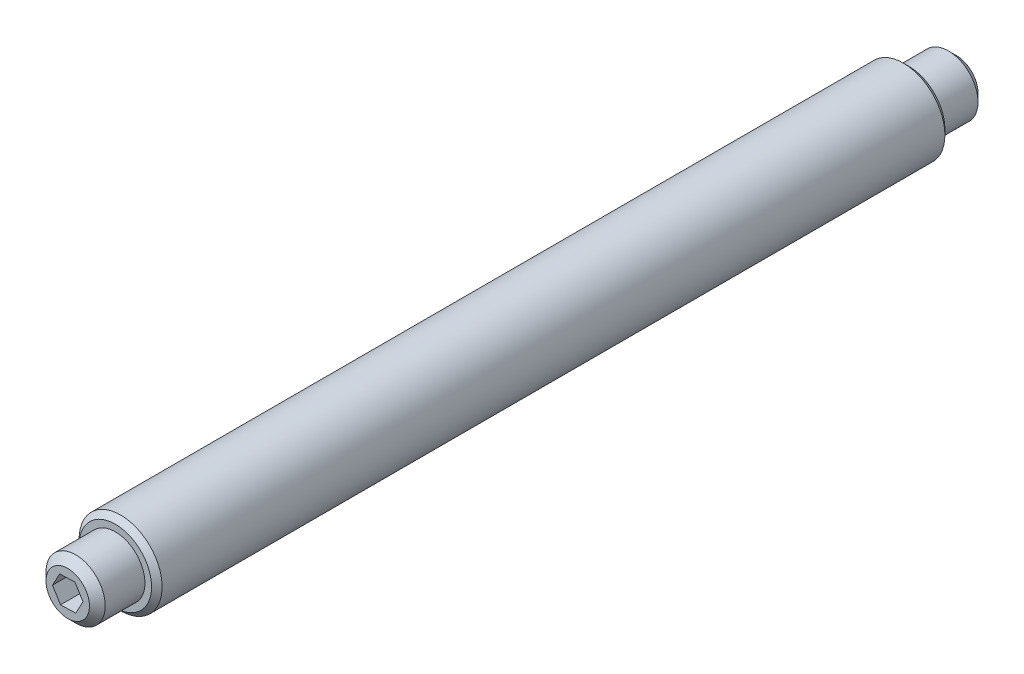
ISO-10303-21;
HEADER;
FILE_DESCRIPTION(('STEP AP214'),'2;1');
FILE_NAME('part.step','',(''),(''),'','','');
FILE_SCHEMA(('AUTOMOTIVE_DESIGN { 1 0 10303 214 1 1 1 1 }'));
ENDSEC;
DATA;
#1=APPLICATION_CONTEXT('core data for automotive mechanical design processes');
#2=APPLICATION_PROTOCOL_DEFINITION('international standard','automotive_design',2000,#1);
#3=PRODUCT_CONTEXT('',#1,'mechanical');
#4=PRODUCT('Part','Part','',(#3));
#5=PRODUCT_RELATED_PRODUCT_CATEGORY('part','',(#4));
#6=PRODUCT_DEFINITION_FORMATION('','',#4);
#7=PRODUCT_DEFINITION_CONTEXT('part definition',#1,'design');
#8=PRODUCT_DEFINITION('design','',#6,#7);
#9=PRODUCT_DEFINITION_SHAPE('','',#8);
#10=(LENGTH_UNIT() NAMED_UNIT(*) SI_UNIT(.MILLI.,.METRE.));
#11=(NAMED_UNIT(*) PLANE_ANGLE_UNIT() SI_UNIT($,.RADIAN.));
#12=(NAMED_UNIT(*) SI_UNIT($,.STERADIAN.) SOLID_ANGLE_UNIT());
#13=UNCERTAINTY_MEASURE_WITH_UNIT(LENGTH_MEASURE(1.E-05),#10,'distance_accuracy_value','');
#14=(GEOMETRIC_REPRESENTATION_CONTEXT(3) GLOBAL_UNCERTAINTY_ASSIGNED_CONTEXT((#13)) GLOBAL_UNIT_ASSIGNED_CONTEXT((#10,
#11,#12)) REPRESENTATION_CONTEXT('',''));
#15=CARTESIAN_POINT('',(0.,0.,0.));
#16=DIRECTION('',(0.,0.,1.));
#17=DIRECTION('',(1.,0.,0.));
#18=AXIS2_PLACEMENT_3D('',#15,#16,#17);
#19=CARTESIAN_POINT('',(0.,0.,19.05));
#20=DIRECTION('',(0.,0.,-1.));
#21=DIRECTION('',(-1.,0.,0.));
#22=AXIS2_PLACEMENT_3D('',#19,#20,#21);
#23=CYLINDRICAL_SURFACE('',#22,1.9939);
#24=CARTESIAN_POINT('',(0.,0.,18.796));
#25=DIRECTION('',(0.,0.,1.));
#26=DIRECTION('',(1.,0.,0.));
#27=AXIS2_PLACEMENT_3D('',#24,#25,#26);
#28=CIRCLE('',#27,1.9939);
#29=CARTESIAN_POINT('',(-1.9939,0.,18.796));
#30=VERTEX_POINT('',#29);
#31=EDGE_CURVE('P0_E11',#30,#30,#28,.F.);
#32=CARTESIAN_POINT('',(0.,0.,-18.7959999999999));
#33=DIRECTION('',(0.,0.,1.));
#34=DIRECTION('',(1.,0.,0.));
#35=AXIS2_PLACEMENT_3D('',#32,#33,#34);
#36=CIRCLE('',#35,1.9939);
#37=CARTESIAN_POINT('',(-1.9939,0.,-18.796));
#38=VERTEX_POINT('',#37);
#39=EDGE_CURVE('P0_E63',#38,#38,#36,.T.);
#40=CARTESIAN_POINT('',(-1.9939,0.,18.796));
#41=CARTESIAN_POINT('',(-1.9939,0.,18.4044166666667));
#42=CARTESIAN_POINT('',(-1.9939,0.,18.0128333333333));
#43=CARTESIAN_POINT('',(-1.9939,0.,17.2296666666667));
#44=CARTESIAN_POINT('',(-1.9939,0.,16.8380833333333));
#45=CARTESIAN_POINT('',(-1.9939,0.,16.0549166666667));
#46=CARTESIAN_POINT('',(-1.9939,0.,15.6633333333333));
#47=CARTESIAN_POINT('',(-1.9939,0.,14.8801666666667));
#48=CARTESIAN_POINT('',(-1.9939,0.,14.4885833333333));
#49=CARTESIAN_POINT('',(-1.9939,0.,13.7054166666667));
#50=CARTESIAN_POINT('',(-1.9939,0.,13.3138333333333));
#51=CARTESIAN_POINT('',(-1.9939,0.,12.5306666666667));
#52=CARTESIAN_POINT('',(-1.9939,0.,12.1390833333334));
#53=CARTESIAN_POINT('',(-1.9939,0.,11.3559166666667));
#54=CARTESIAN_POINT('',(-1.9939,0.,10.9643333333334));
#55=CARTESIAN_POINT('',(-1.9939,0.,10.1811666666667));
#56=CARTESIAN_POINT('',(-1.9939,0.,9.78958333333335));
#57=CARTESIAN_POINT('',(-1.9939,0.,9.00641666666669));
#58=CARTESIAN_POINT('',(-1.9939,0.,8.61483333333335));
#59=CARTESIAN_POINT('',(-1.9939,0.,7.83166666666669));
#60=CARTESIAN_POINT('',(-1.9939,0.,7.44008333333336));
#61=CARTESIAN_POINT('',(-1.9939,0.,6.65691666666669));
#62=CARTESIAN_POINT('',(-1.9939,0.,6.26533333333336));
#63=CARTESIAN_POINT('',(-1.9939,0.,5.48216666666669));
#64=CARTESIAN_POINT('',(-1.9939,0.,5.09058333333336));
#65=CARTESIAN_POINT('',(-1.9939,0.,4.30741666666669));
#66=CARTESIAN_POINT('',(-1.9939,0.,3.91583333333336));
#67=CARTESIAN_POINT('',(-1.9939,0.,3.13266666666669));
#68=CARTESIAN_POINT('',(-1.9939,0.,2.74108333333336));
#69=CARTESIAN_POINT('',(-1.9939,0.,1.95791666666669));
#70=CARTESIAN_POINT('',(-1.9939,0.,1.56633333333336));
#71=CARTESIAN_POINT('',(-1.9939,0.,0.783166666666694));
#72=CARTESIAN_POINT('',(-1.9939,0.,0.391583333333361));
#73=CARTESIAN_POINT('',(-1.9939,0.,-0.391583333333305));
#74=CARTESIAN_POINT('',(-1.9939,0.,-0.783166666666638));
#75=CARTESIAN_POINT('',(-1.9939,0.,-1.5663333333333));
#76=CARTESIAN_POINT('',(-1.9939,0.,-1.95791666666664));
#77=CARTESIAN_POINT('',(-1.9939,0.,-2.7410833333333));
#78=CARTESIAN_POINT('',(-1.9939,0.,-3.13266666666664));
#79=CARTESIAN_POINT('',(-1.9939,0.,-3.9158333333333));
#80=CARTESIAN_POINT('',(-1.9939,0.,-4.30741666666663));
#81=CARTESIAN_POINT('',(-1.9939,0.,-5.0905833333333));
#82=CARTESIAN_POINT('',(-1.9939,0.,-5.48216666666664));
#83=CARTESIAN_POINT('',(-1.9939,0.,-6.2653333333333));
#84=CARTESIAN_POINT('',(-1.9939,0.,-6.65691666666663));
#85=CARTESIAN_POINT('',(-1.9939,0.,-7.4400833333333));
#86=CARTESIAN_POINT('',(-1.9939,0.,-7.83166666666663));
#87=CARTESIAN_POINT('',(-1.9939,0.,-8.6148333333333));
#88=CARTESIAN_POINT('',(-1.9939,0.,-9.00641666666663));
#89=CARTESIAN_POINT('',(-1.9939,0.,-9.7895833333333));
#90=CARTESIAN_POINT('',(-1.9939,0.,-10.1811666666666));
#91=CARTESIAN_POINT('',(-1.9939,0.,-10.9643333333333));
#92=CARTESIAN_POINT('',(-1.9939,0.,-11.3559166666666));
#93=CARTESIAN_POINT('',(-1.9939,0.,-12.1390833333333));
#94=CARTESIAN_POINT('',(-1.9939,0.,-12.5306666666666));
#95=CARTESIAN_POINT('',(-1.9939,0.,-13.3138333333333));
#96=CARTESIAN_POINT('',(-1.9939,0.,-13.7054166666666));
#97=CARTESIAN_POINT('',(-1.9939,0.,-14.4885833333333));
#98=CARTESIAN_POINT('',(-1.9939,0.,-14.8801666666666));
#99=CARTESIAN_POINT('',(-1.9939,0.,-15.6633333333333));
#100=CARTESIAN_POINT('',(-1.9939,0.,-16.0549166666666));
#101=CARTESIAN_POINT('',(-1.9939,0.,-16.8380833333333));
#102=CARTESIAN_POINT('',(-1.9939,0.,-17.2296666666666));
#103=CARTESIAN_POINT('',(-1.9939,0.,-18.0128333333333));
#104=CARTESIAN_POINT('',(-1.9939,0.,-18.4044166666666));
#105=CARTESIAN_POINT('',(-1.9939,0.,-18.796));
#106=B_SPLINE_CURVE_WITH_KNOTS('',3,(#40,#41,#42,#43,#44,#45,#46,#47,#48,#49,#50,#51,#52,#53,
#54,#55,#56,#57,#58,#59,#60,#61,#62,#63,#64,#65,#66,#67,#68,#69,#70,#71,#72,#73,#74,#75,#76,#77,
#78,#79,#80,#81,#82,#83,#84,#85,#86,#87,#88,#89,#90,#91,#92,#93,#94,#95,#96,#97,#98,#99,#100,
#101,#102,#103,#104,#105),.UNSPECIFIED.,.F.,.F.,(4,2,2,2,2,2,2,2,2,2,2,2,2,2,2,2,2,2,2,2,2,2,2,
2,2,2,2,2,2,2,2,2,4),(0.,1.17475,2.3495,3.52425,4.69899999999999,5.87374999999999,
7.04849999999999,8.22324999999999,9.39799999999999,10.57275,11.7475,12.92225,14.097,15.27175,
16.4465,17.62125,18.796,19.97075,21.1455,22.32025,23.495,24.66975,25.8445,27.01925,28.194,
29.36875,30.5435,31.71825,32.893,34.06775,35.2425,36.41725,37.592),.UNSPECIFIED.);
#107=EDGE_CURVE('P0_BSEAM17',#30,#38,#106,.T.);
#108=ORIENTED_EDGE('',*,*,#31,.T.);
#109=ORIENTED_EDGE('',*,*,#39,.T.);
#110=ORIENTED_EDGE('',*,*,#107,.T.);
#111=ORIENTED_EDGE('',*,*,#107,.F.);
#112=EDGE_LOOP('',(#108,#110,#109,#111));
#113=FACE_BOUND('',#112,.T.);
#114=ADVANCED_FACE('P0_F17',(#113),#23,.T.);
#115=CARTESIAN_POINT('',(0.,0.,19.05));
#116=DIRECTION('',(0.,0.,1.));
#117=DIRECTION('',(1.,0.,0.));
#118=AXIS2_PLACEMENT_3D('',#115,#116,#117);
#119=PLANE('',#118);
#120=CARTESIAN_POINT('',(0.,0.,19.05));
#121=DIRECTION('',(0.,0.,1.));
#122=DIRECTION('',(1.,0.,0.));
#123=AXIS2_PLACEMENT_3D('',#120,#121,#122);
#124=CIRCLE('',#123,1.42239999999999);
#125=CARTESIAN_POINT('',(1.42239999999999,0.,19.05));
#126=VERTEX_POINT('',#125);
#127=EDGE_CURVE('P0_E60',#126,#126,#124,.T.);
#128=ORIENTED_EDGE('',*,*,#127,.F.);
#129=EDGE_LOOP('',(#128));
#130=FACE_BOUND('',#129,.T.);
#131=CARTESIAN_POINT('',(0.,0.,19.05));
#132=DIRECTION('',(0.,0.,1.));
#133=DIRECTION('',(1.,0.,0.));
#134=AXIS2_PLACEMENT_3D('',#131,#132,#133);
#135=CIRCLE('',#134,1.73990000000002);
#136=CARTESIAN_POINT('',(1.73990000000002,0.,19.05));
#137=VERTEX_POINT('',#136);
#138=EDGE_CURVE('P0_E25',#137,#137,#135,.T.);
#139=ORIENTED_EDGE('',*,*,#138,.T.);
#140=EDGE_LOOP('',(#139));
#141=FACE_BOUND('',#140,.T.);
#142=ADVANCED_FACE('P0_F71',(#130,#141),#119,.T.);
#143=CARTESIAN_POINT('',(0.,0.,-19.05));
#144=DIRECTION('',(0.,0.,1.));
#145=DIRECTION('',(1.,0.,0.));
#146=AXIS2_PLACEMENT_3D('',#143,#144,#145);
#147=PLANE('',#146);
#148=CARTESIAN_POINT('',(0.,0.,-19.05));
#149=DIRECTION('',(0.,0.,-1.));
#150=DIRECTION('',(-1.,0.,0.));
#151=AXIS2_PLACEMENT_3D('',#148,#149,#150);
#152=CIRCLE('',#151,1.42239999999999);
#153=CARTESIAN_POINT('',(-1.42239999999999,0.,-19.05));
#154=VERTEX_POINT('',#153);
#155=EDGE_CURVE('P0_E48',#154,#154,#152,.T.);
#156=ORIENTED_EDGE('',*,*,#155,.F.);
#157=EDGE_LOOP('',(#156));
#158=FACE_BOUND('',#157,.T.);
#159=CARTESIAN_POINT('',(0.,0.,-19.05));
#160=DIRECTION('',(0.,0.,1.));
#161=DIRECTION('',(1.,0.,0.));
#162=AXIS2_PLACEMENT_3D('',#159,#160,#161);
#163=CIRCLE('',#162,1.73989999999995);
#164=CARTESIAN_POINT('',(1.73989999999995,0.,-19.05));
#165=VERTEX_POINT('',#164);
#166=EDGE_CURVE('P0_E66',#165,#165,#163,.F.);
#167=ORIENTED_EDGE('',*,*,#166,.T.);
#168=EDGE_LOOP('',(#167));
#169=FACE_BOUND('',#168,.T.);
#170=ADVANCED_FACE('P0_F86',(#158,#169),#147,.F.);
#171=CARTESIAN_POINT('',(0.,0.,-18.7959999999999));
#172=DIRECTION('',(0.,0.,1.));
#173=DIRECTION('',(1.,0.,0.));
#174=AXIS2_PLACEMENT_3D('',#171,#172,#173);
#175=CONICAL_SURFACE('',#174,1.9939,0.785398163397449);
#176=ORIENTED_EDGE('',*,*,#166,.F.);
#177=EDGE_LOOP('',(#176));
#178=FACE_BOUND('',#177,.T.);
#179=ORIENTED_EDGE('',*,*,#39,.F.);
#180=EDGE_LOOP('',(#179));
#181=FACE_BOUND('',#180,.T.);
#182=ADVANCED_FACE('P0_F75',(#178,#181),#175,.T.);
#183=CARTESIAN_POINT('',(0.,0.,19.05));
#184=DIRECTION('',(0.,0.,-1.));
#185=DIRECTION('',(-1.,0.,0.));
#186=AXIS2_PLACEMENT_3D('',#183,#184,#185);
#187=CONICAL_SURFACE('',#186,1.73990000000002,0.785398163397436);
#188=ORIENTED_EDGE('',*,*,#31,.F.);
#189=EDGE_LOOP('',(#188));
#190=FACE_BOUND('',#189,.T.);
#191=ORIENTED_EDGE('',*,*,#138,.F.);
#192=EDGE_LOOP('',(#191));
#193=FACE_BOUND('',#192,.T.);
#194=ADVANCED_FACE('P0_F19',(#190,#193),#187,.T.);
#195=CARTESIAN_POINT('',(0.,0.,19.05));
#196=DIRECTION('',(0.,0.,1.));
#197=DIRECTION('',(1.,0.,0.));
#198=AXIS2_PLACEMENT_3D('',#195,#196,#197);
#199=CYLINDRICAL_SURFACE('',#198,1.4224);
#200=CARTESIAN_POINT('',(0.,0.,14.986));
#201=DIRECTION('',(0.,0.,1.));
#202=DIRECTION('',(1.,0.,0.));
#203=AXIS2_PLACEMENT_3D('',#200,#201,#202);
#204=CIRCLE('',#203,1.4224);
#205=CARTESIAN_POINT('',(1.4224,0.,14.986));
#206=VERTEX_POINT('',#205);
#207=EDGE_CURVE('P0_E57',#206,#206,#204,.T.);
#208=ORIENTED_EDGE('',*,*,#207,.F.);
#209=EDGE_LOOP('',(#208));
#210=FACE_BOUND('',#209,.T.);
#211=ORIENTED_EDGE('',*,*,#127,.T.);
#212=EDGE_LOOP('',(#211));
#213=FACE_BOUND('',#212,.T.);
#214=ADVANCED_FACE('P0_F74',(#210,#213),#199,.F.);
#215=CARTESIAN_POINT('',(1.1303,0.,14.986));
#216=DIRECTION('',(0.,0.,-1.));
#217=DIRECTION('',(-1.,0.,0.));
#218=AXIS2_PLACEMENT_3D('',#215,#216,#217);
#219=PLANE('',#218);
#220=CARTESIAN_POINT('',(0.,0.,14.986));
#221=DIRECTION('',(0.,0.,1.));
#222=DIRECTION('',(1.,0.,0.));
#223=AXIS2_PLACEMENT_3D('',#220,#221,#222);
#224=CIRCLE('',#223,1.1303);
#225=CARTESIAN_POINT('',(1.1303,0.,14.986));
#226=VERTEX_POINT('',#225);
#227=EDGE_CURVE('P0_E54',#226,#226,#224,.T.);
#228=ORIENTED_EDGE('',*,*,#227,.F.);
#229=EDGE_LOOP('',(#228));
#230=FACE_BOUND('',#229,.T.);
#231=ORIENTED_EDGE('',*,*,#207,.T.);
#232=EDGE_LOOP('',(#231));
#233=FACE_BOUND('',#232,.T.);
#234=ADVANCED_FACE('P0_F83',(#230,#233),#219,.F.);
#235=CARTESIAN_POINT('',(0.,0.,19.05));
#236=DIRECTION('',(0.,0.,1.));
#237=DIRECTION('',(1.,0.,0.));
#238=AXIS2_PLACEMENT_3D('',#235,#236,#237);
#239=CYLINDRICAL_SURFACE('',#238,1.1303);
#240=CARTESIAN_POINT('',(0.,0.,13.97));
#241=DIRECTION('',(0.,0.,1.));
#242=DIRECTION('',(1.,0.,0.));
#243=AXIS2_PLACEMENT_3D('',#240,#241,#242);
#244=CIRCLE('',#243,1.1303);
#245=CARTESIAN_POINT('',(1.1303,0.,13.97));
#246=VERTEX_POINT('',#245);
#247=EDGE_CURVE('P0_E51',#246,#246,#244,.T.);
#248=ORIENTED_EDGE('',*,*,#247,.F.);
#249=EDGE_LOOP('',(#248));
#250=FACE_BOUND('',#249,.T.);
#251=ORIENTED_EDGE('',*,*,#227,.T.);
#252=EDGE_LOOP('',(#251));
#253=FACE_BOUND('',#252,.T.);
#254=ADVANCED_FACE('P0_F105',(#250,#253),#239,.F.);
#255=CARTESIAN_POINT('',(0.,0.,13.97));
#256=DIRECTION('',(0.,0.,1.));
#257=DIRECTION('',(1.,0.,0.));
#258=AXIS2_PLACEMENT_3D('',#255,#256,#257);
#259=CONICAL_SURFACE('',#258,1.1303,1.02974425867665);
#260=CARTESIAN_POINT('',(0.,0.,13.2908472423132));
#261=VERTEX_POINT('',#260);
#262=VERTEX_LOOP('',#261);
#263=FACE_BOUND('',#262,.T.);
#264=ORIENTED_EDGE('',*,*,#247,.T.);
#265=EDGE_LOOP('',(#264));
#266=FACE_BOUND('',#265,.T.);
#267=ADVANCED_FACE('P0_F109',(#263,#266),#259,.F.);
#268=CARTESIAN_POINT('',(0.,0.,-19.05));
#269=DIRECTION('',(0.,0.,-1.));
#270=DIRECTION('',(-1.,0.,0.));
#271=AXIS2_PLACEMENT_3D('',#268,#269,#270);
#272=CYLINDRICAL_SURFACE('',#271,1.4224);
#273=CARTESIAN_POINT('',(0.,0.,-14.986));
#274=DIRECTION('',(0.,0.,-1.));
#275=DIRECTION('',(-1.,0.,0.));
#276=AXIS2_PLACEMENT_3D('',#273,#274,#275);
#277=CIRCLE('',#276,1.4224);
#278=CARTESIAN_POINT('',(-1.4224,0.,-14.986));
#279=VERTEX_POINT('',#278);
#280=EDGE_CURVE('P0_E43',#279,#279,#277,.T.);
#281=ORIENTED_EDGE('',*,*,#280,.F.);
#282=EDGE_LOOP('',(#281));
#283=FACE_BOUND('',#282,.T.);
#284=ORIENTED_EDGE('',*,*,#155,.T.);
#285=EDGE_LOOP('',(#284));
#286=FACE_BOUND('',#285,.T.);
#287=ADVANCED_FACE('P0_F113',(#283,#286),#272,.F.);
#288=CARTESIAN_POINT('',(1.1303,0.,-14.986));
#289=DIRECTION('',(0.,0.,1.));
#290=DIRECTION('',(1.,0.,0.));
#291=AXIS2_PLACEMENT_3D('',#288,#289,#290);
#292=PLANE('',#291);
#293=CARTESIAN_POINT('',(0.,0.,-14.986));
#294=DIRECTION('',(0.,0.,-1.));
#295=DIRECTION('',(-1.,0.,0.));
#296=AXIS2_PLACEMENT_3D('',#293,#294,#295);
#297=CIRCLE('',#296,1.1303);
#298=CARTESIAN_POINT('',(-1.1303,0.,-14.986));
#299=VERTEX_POINT('',#298);
#300=EDGE_CURVE('P0_E40',#299,#299,#297,.T.);
#301=ORIENTED_EDGE('',*,*,#300,.F.);
#302=EDGE_LOOP('',(#301));
#303=FACE_BOUND('',#302,.T.);
#304=ORIENTED_EDGE('',*,*,#280,.T.);
#305=EDGE_LOOP('',(#304));
#306=FACE_BOUND('',#305,.T.);
#307=ADVANCED_FACE('P0_F116',(#303,#306),#292,.F.);
#308=CARTESIAN_POINT('',(0.,0.,-19.05));
#309=DIRECTION('',(0.,0.,-1.));
#310=DIRECTION('',(-1.,0.,0.));
#311=AXIS2_PLACEMENT_3D('',#308,#309,#310);
#312=CYLINDRICAL_SURFACE('',#311,1.1303);
#313=CARTESIAN_POINT('',(0.,0.,-13.97));
#314=DIRECTION('',(0.,0.,-1.));
#315=DIRECTION('',(-1.,0.,0.));
#316=AXIS2_PLACEMENT_3D('',#313,#314,#315);
#317=CIRCLE('',#316,1.1303);
#318=CARTESIAN_POINT('',(-1.1303,0.,-13.97));
#319=VERTEX_POINT('',#318);
#320=EDGE_CURVE('P0_E38',#319,#319,#317,.T.);
#321=ORIENTED_EDGE('',*,*,#320,.F.);
#322=EDGE_LOOP('',(#321));
#323=FACE_BOUND('',#322,.T.);
#324=ORIENTED_EDGE('',*,*,#300,.T.);
#325=EDGE_LOOP('',(#324));
#326=FACE_BOUND('',#325,.T.);
#327=ADVANCED_FACE('P0_F34',(#323,#326),#312,.F.);
#328=CARTESIAN_POINT('',(0.,0.,-13.97));
#329=DIRECTION('',(0.,0.,-1.));
#330=DIRECTION('',(-1.,0.,0.));
#331=AXIS2_PLACEMENT_3D('',#328,#329,#330);
#332=CONICAL_SURFACE('',#331,1.1303,1.02974425867665);
#333=CARTESIAN_POINT('',(0.,0.,-13.2908472423132));
#334=VERTEX_POINT('',#333);
#335=VERTEX_LOOP('',#334);
#336=FACE_BOUND('',#335,.T.);
#337=ORIENTED_EDGE('',*,*,#320,.T.);
#338=EDGE_LOOP('',(#337));
#339=FACE_BOUND('',#338,.T.);
#340=ADVANCED_FACE('P0_F31',(#336,#339),#332,.F.);
#341=CLOSED_SHELL('',(#114,#142,#170,#182,#194,#214,#234,#254,#267,#287,#307,#327,#340));
#342=MANIFOLD_SOLID_BREP('P0_B1',#341);
#343=CARTESIAN_POINT('',(0.,0.,-21.336));
#344=DIRECTION('',(0.,0.,-1.));
#345=DIRECTION('',(-0.998607089664267,0.0527624911491326,0.));
#346=AXIS2_PLACEMENT_3D('',#343,#344,#345);
#347=PLANE('',#346);
#348=CARTESIAN_POINT('',(0.,0.,-21.336));
#349=DIRECTION('',(0.,0.,-1.));
#350=DIRECTION('',(-0.998607089664267,0.0527624911491326,0.));
#351=AXIS2_PLACEMENT_3D('',#348,#349,#350);
#352=CIRCLE('',#351,1.04394);
#353=CARTESIAN_POINT('',(-1.04248588518412,0.0550808750102255,-21.336));
#354=VERTEX_POINT('',#353);
#355=EDGE_CURVE('P1_E11',#354,#354,#352,.T.);
#356=ORIENTED_EDGE('',*,*,#355,.T.);
#357=EDGE_LOOP('',(#356));
#358=FACE_BOUND('',#357,.T.);
#359=DIRECTION('',(0.998607089664267,-0.0527624911491327,0.));
#360=VECTOR('',#359,1.);
#361=CARTESIAN_POINT('',(-0.332602573860832,0.653459150364036,-21.336));
#362=LINE('',#361,#360);
#363=CARTESIAN_POINT('',(-0.332602573860832,0.653459150364036,-21.336));
#364=VERTEX_POINT('',#363);
#365=CARTESIAN_POINT('',(0.399610937620231,0.614771853509591,-21.336));
#366=VERTEX_POINT('',#365);
#367=EDGE_CURVE('P1_E78',#364,#366,#362,.T.);
#368=ORIENTED_EDGE('',*,*,#367,.F.);
#369=DIRECTION('',(-0.544997202534234,-0.838437862473934,0.));
#370=VECTOR('',#369,1.);
#371=CARTESIAN_POINT('',(-0.332602573860832,0.653459150364036,-21.336));
#372=LINE('',#371,#370);
#373=CARTESIAN_POINT('',(-0.732213511481063,0.0386872968544494,-21.336));
#374=VERTEX_POINT('',#373);
#375=EDGE_CURVE('P1_E31',#364,#374,#372,.T.);
#376=ORIENTED_EDGE('',*,*,#375,.T.);
#377=DIRECTION('',(-0.453609887130033,0.891200353623066,0.));
#378=VECTOR('',#377,1.);
#379=CARTESIAN_POINT('',(-0.399610937620231,-0.614771853509583,-21.336));
#380=LINE('',#379,#378);
#381=CARTESIAN_POINT('',(-0.399610937620231,-0.614771853509583,-21.336));
#382=VERTEX_POINT('',#381);
#383=EDGE_CURVE('P1_E84',#382,#374,#380,.T.);
#384=ORIENTED_EDGE('',*,*,#383,.F.);
#385=DIRECTION('',(0.998607089664267,-0.0527624911491326,0.));
#386=VECTOR('',#385,1.);
#387=CARTESIAN_POINT('',(-0.399610937620231,-0.614771853509583,-21.336));
#388=LINE('',#387,#386);
#389=CARTESIAN_POINT('',(0.332602573860833,-0.653459150364028,-21.336));
#390=VERTEX_POINT('',#389);
#391=EDGE_CURVE('P1_E104',#382,#390,#388,.T.);
#392=ORIENTED_EDGE('',*,*,#391,.T.);
#393=DIRECTION('',(0.544997202534234,0.838437862473934,0.));
#394=VECTOR('',#393,1.);
#395=CARTESIAN_POINT('',(0.332602573860833,-0.653459150364028,-21.336));
#396=LINE('',#395,#394);
#397=CARTESIAN_POINT('',(0.732213511481064,-0.0386872968544408,-21.336));
#398=VERTEX_POINT('',#397);
#399=EDGE_CURVE('P1_E107',#390,#398,#396,.T.);
#400=ORIENTED_EDGE('',*,*,#399,.T.);
#401=DIRECTION('',(0.453609887130033,-0.891200353623066,0.));
#402=VECTOR('',#401,1.);
#403=CARTESIAN_POINT('',(0.399610937620231,0.614771853509591,-21.336));
#404=LINE('',#403,#402);
#405=EDGE_CURVE('P1_E110',#366,#398,#404,.T.);
#406=ORIENTED_EDGE('',*,*,#405,.F.);
#407=EDGE_LOOP('',(#368,#376,#384,#392,#400,#406));
#408=FACE_BOUND('',#407,.T.);
#409=ADVANCED_FACE('P1_F17',(#358,#408),#347,.T.);
#410=CARTESIAN_POINT('',(0.,0.,-21.336));
#411=DIRECTION('',(0.,0.,1.));
#412=DIRECTION('',(0.998607089664267,-0.0527624911491326,0.));
#413=AXIS2_PLACEMENT_3D('',#410,#411,#412);
#414=CONICAL_SURFACE('',#413,1.04394,0.785398163397426);
#415=CARTESIAN_POINT('',(0.,0.,-20.95754));
#416=DIRECTION('',(0.,0.,-1.));
#417=DIRECTION('',(-0.998607089664267,0.0527624911491326,0.));
#418=AXIS2_PLACEMENT_3D('',#415,#416,#417);
#419=CIRCLE('',#418,1.4224);
#420=CARTESIAN_POINT('',(-1.42041872433845,0.0750493674105262,-20.95754));
#421=VERTEX_POINT('',#420);
#422=EDGE_CURVE('P1_E24',#421,#421,#419,.T.);
#423=ORIENTED_EDGE('',*,*,#422,.T.);
#424=EDGE_LOOP('',(#423));
#425=FACE_BOUND('',#424,.T.);
#426=ORIENTED_EDGE('',*,*,#355,.F.);
#427=EDGE_LOOP('',(#426));
#428=FACE_BOUND('',#427,.T.);
#429=ADVANCED_FACE('P1_F130',(#425,#428),#414,.T.);
#430=CARTESIAN_POINT('',(0.,0.,-34.036));
#431=DIRECTION('',(0.,0.,-1.));
#432=DIRECTION('',(-0.998607089664267,0.0527624911491326,0.));
#433=AXIS2_PLACEMENT_3D('',#430,#431,#432);
#434=CYLINDRICAL_SURFACE('',#433,1.4224);
#435=CARTESIAN_POINT('',(0.,0.,-15.6337));
#436=DIRECTION('',(0.,0.,-1.));
#437=DIRECTION('',(-0.998607089664267,0.0527624911491326,0.));
#438=AXIS2_PLACEMENT_3D('',#435,#436,#437);
#439=CIRCLE('',#438,1.4224);
#440=CARTESIAN_POINT('',(-1.42041872433845,0.0750493674105262,-15.6337));
#441=VERTEX_POINT('',#440);
#442=EDGE_CURVE('P1_E125',#441,#441,#439,.T.);
#443=ORIENTED_EDGE('',*,*,#442,.T.);
#444=EDGE_LOOP('',(#443));
#445=FACE_BOUND('',#444,.T.);
#446=ORIENTED_EDGE('',*,*,#422,.F.);
#447=EDGE_LOOP('',(#446));
#448=FACE_BOUND('',#447,.T.);
#449=ADVANCED_FACE('P1_F133',(#445,#448),#434,.T.);
#450=CARTESIAN_POINT('',(0.,0.,-15.6337));
#451=DIRECTION('',(0.,0.,-1.));
#452=DIRECTION('',(-0.998607089664267,0.0527624911491326,0.));
#453=AXIS2_PLACEMENT_3D('',#450,#451,#452);
#454=CONICAL_SURFACE('',#453,1.4224,0.785398163397453);
#455=CARTESIAN_POINT('',(0.,0.,-14.986));
#456=DIRECTION('',(0.,0.,-1.));
#457=DIRECTION('',(-0.998607089664267,0.0527624911491326,0.));
#458=AXIS2_PLACEMENT_3D('',#455,#456,#457);
#459=CIRCLE('',#458,0.7747);
#460=CARTESIAN_POINT('',(-0.773620912362907,0.040875101893233,-14.986));
#461=VERTEX_POINT('',#460);
#462=EDGE_CURVE('P1_E85',#461,#461,#459,.T.);
#463=ORIENTED_EDGE('',*,*,#462,.T.);
#464=EDGE_LOOP('',(#463));
#465=FACE_BOUND('',#464,.T.);
#466=ORIENTED_EDGE('',*,*,#442,.F.);
#467=EDGE_LOOP('',(#466));
#468=FACE_BOUND('',#467,.T.);
#469=ADVANCED_FACE('P1_F135',(#465,#468),#454,.T.);
#470=CARTESIAN_POINT('',(0.,0.,-15.4514867215606));
#471=DIRECTION('',(0.,0.,1.));
#472=DIRECTION('',(0.998607089664267,-0.0527624911491326,0.));
#473=AXIS2_PLACEMENT_3D('',#470,#471,#472);
#474=CONICAL_SURFACE('',#473,0.,1.02974425867666);
#475=ORIENTED_EDGE('',*,*,#462,.F.);
#476=EDGE_LOOP('',(#475));
#477=FACE_BOUND('',#476,.T.);
#478=CARTESIAN_POINT('',(0.,0.,-15.4514867215606));
#479=VERTEX_POINT('',#478);
#480=VERTEX_LOOP('',#479);
#481=FACE_BOUND('',#480,.T.);
#482=ADVANCED_FACE('P1_F143',(#477,#481),#474,.F.);
#483=CARTESIAN_POINT('',(-0.332602573860832,0.653459150364036,-19.558));
#484=DIRECTION('',(0.838437862473934,-0.544997202534234,0.));
#485=DIRECTION('',(0.544997202534234,0.838437862473934,0.));
#486=AXIS2_PLACEMENT_3D('',#483,#484,#485);
#487=PLANE('',#486);
#488=ORIENTED_EDGE('',*,*,#375,.F.);
#489=DIRECTION('',(0.,0.,-1.));
#490=VECTOR('',#489,1.);
#491=CARTESIAN_POINT('',(-0.332602573860832,0.653459150364036,-19.558));
#492=LINE('',#491,#490);
#493=CARTESIAN_POINT('',(-0.332602573860832,0.653459150364036,-19.558));
#494=VERTEX_POINT('',#493);
#495=EDGE_CURVE('P1_E72',#494,#364,#492,.T.);
#496=ORIENTED_EDGE('',*,*,#495,.F.);
#497=DIRECTION('',(-0.544997202534234,-0.838437862473934,0.));
#498=VECTOR('',#497,1.);
#499=CARTESIAN_POINT('',(-0.332602573860832,0.653459150364036,-19.558));
#500=LINE('',#499,#498);
#501=CARTESIAN_POINT('',(-0.732213511481063,0.0386872968544494,-19.558));
#502=VERTEX_POINT('',#501);
#503=EDGE_CURVE('P1_E67',#494,#502,#500,.T.);
#504=ORIENTED_EDGE('',*,*,#503,.T.);
#505=DIRECTION('',(0.,0.,-1.));
#506=VECTOR('',#505,1.);
#507=CARTESIAN_POINT('',(-0.732213511481063,0.0386872968544494,-19.558));
#508=LINE('',#507,#506);
#509=EDGE_CURVE('P1_E70',#502,#374,#508,.T.);
#510=ORIENTED_EDGE('',*,*,#509,.T.);
#511=EDGE_LOOP('',(#488,#496,#504,#510));
#512=FACE_BOUND('',#511,.T.);
#513=ADVANCED_FACE('P1_F69',(#512),#487,.T.);
#514=CARTESIAN_POINT('',(-0.39961093762023,-0.614771853509583,-19.558));
#515=DIRECTION('',(-0.891200353623066,-0.453609887130033,0.));
#516=DIRECTION('',(0.453609887130033,-0.891200353623066,0.));
#517=AXIS2_PLACEMENT_3D('',#514,#515,#516);
#518=PLANE('',#517);
#519=ORIENTED_EDGE('',*,*,#383,.T.);
#520=ORIENTED_EDGE('',*,*,#509,.F.);
#521=DIRECTION('',(-0.453609887130033,0.891200353623066,0.));
#522=VECTOR('',#521,1.);
#523=CARTESIAN_POINT('',(-0.39961093762023,-0.614771853509583,-19.558));
#524=LINE('',#523,#522);
#525=CARTESIAN_POINT('',(-0.39961093762023,-0.614771853509583,-19.558));
#526=VERTEX_POINT('',#525);
#527=EDGE_CURVE('P1_E77',#526,#502,#524,.T.);
#528=ORIENTED_EDGE('',*,*,#527,.F.);
#529=DIRECTION('',(0.,0.,-1.));
#530=VECTOR('',#529,1.);
#531=CARTESIAN_POINT('',(-0.39961093762023,-0.614771853509583,-19.558));
#532=LINE('',#531,#530);
#533=EDGE_CURVE('P1_E86',#526,#382,#532,.T.);
#534=ORIENTED_EDGE('',*,*,#533,.T.);
#535=EDGE_LOOP('',(#519,#520,#528,#534));
#536=FACE_BOUND('',#535,.T.);
#537=ADVANCED_FACE('P1_F82',(#536),#518,.F.);
#538=CARTESIAN_POINT('',(-0.39961093762023,-0.614771853509583,-19.558));
#539=DIRECTION('',(0.0527624911491326,0.998607089664267,0.));
#540=DIRECTION('',(-0.998607089664267,0.0527624911491326,0.));
#541=AXIS2_PLACEMENT_3D('',#538,#539,#540);
#542=PLANE('',#541);
#543=ORIENTED_EDGE('',*,*,#391,.F.);
#544=ORIENTED_EDGE('',*,*,#533,.F.);
#545=DIRECTION('',(0.998607089664267,-0.0527624911491326,0.));
#546=VECTOR('',#545,1.);
#547=CARTESIAN_POINT('',(-0.39961093762023,-0.614771853509583,-19.558));
#548=LINE('',#547,#546);
#549=CARTESIAN_POINT('',(0.332602573860833,-0.653459150364028,-19.558));
#550=VERTEX_POINT('',#549);
#551=EDGE_CURVE('P1_E91',#526,#550,#548,.T.);
#552=ORIENTED_EDGE('',*,*,#551,.T.);
#553=DIRECTION('',(0.,0.,-1.));
#554=VECTOR('',#553,1.);
#555=CARTESIAN_POINT('',(0.332602573860833,-0.653459150364028,-19.558));
#556=LINE('',#555,#554);
#557=EDGE_CURVE('P1_E120',#550,#390,#556,.T.);
#558=ORIENTED_EDGE('',*,*,#557,.T.);
#559=EDGE_LOOP('',(#543,#544,#552,#558));
#560=FACE_BOUND('',#559,.T.);
#561=ADVANCED_FACE('P1_F166',(#560),#542,.T.);
#562=CARTESIAN_POINT('',(0.332602573860833,-0.653459150364028,-19.558));
#563=DIRECTION('',(-0.838437862473934,0.544997202534234,0.));
#564=DIRECTION('',(-0.544997202534234,-0.838437862473934,0.));
#565=AXIS2_PLACEMENT_3D('',#562,#563,#564);
#566=PLANE('',#565);
#567=ORIENTED_EDGE('',*,*,#399,.F.);
#568=ORIENTED_EDGE('',*,*,#557,.F.);
#569=DIRECTION('',(0.544997202534234,0.838437862473934,0.));
#570=VECTOR('',#569,1.);
#571=CARTESIAN_POINT('',(0.332602573860833,-0.653459150364028,-19.558));
#572=LINE('',#571,#570);
#573=CARTESIAN_POINT('',(0.732213511481064,-0.0386872968544408,-19.558));
#574=VERTEX_POINT('',#573);
#575=EDGE_CURVE('P1_E93',#550,#574,#572,.T.);
#576=ORIENTED_EDGE('',*,*,#575,.T.);
#577=DIRECTION('',(0.,0.,-1.));
#578=VECTOR('',#577,1.);
#579=CARTESIAN_POINT('',(0.732213511481064,-0.0386872968544408,-19.558));
#580=LINE('',#579,#578);
#581=EDGE_CURVE('P1_E118',#574,#398,#580,.T.);
#582=ORIENTED_EDGE('',*,*,#581,.T.);
#583=EDGE_LOOP('',(#567,#568,#576,#582));
#584=FACE_BOUND('',#583,.T.);
#585=ADVANCED_FACE('P1_F162',(#584),#566,.T.);
#586=CARTESIAN_POINT('',(0.399610937620231,0.614771853509591,-19.558));
#587=DIRECTION('',(0.891200353623066,0.453609887130033,0.));
#588=DIRECTION('',(-0.453609887130033,0.891200353623066,0.));
#589=AXIS2_PLACEMENT_3D('',#586,#587,#588);
#590=PLANE('',#589);
#591=ORIENTED_EDGE('',*,*,#405,.T.);
#592=ORIENTED_EDGE('',*,*,#581,.F.);
#593=DIRECTION('',(0.453609887130033,-0.891200353623066,0.));
#594=VECTOR('',#593,1.);
#595=CARTESIAN_POINT('',(0.399610937620231,0.614771853509591,-19.558));
#596=LINE('',#595,#594);
#597=CARTESIAN_POINT('',(0.399610937620231,0.614771853509591,-19.558));
#598=VERTEX_POINT('',#597);
#599=EDGE_CURVE('P1_E97',#598,#574,#596,.T.);
#600=ORIENTED_EDGE('',*,*,#599,.F.);
#601=DIRECTION('',(0.,0.,-1.));
#602=VECTOR('',#601,1.);
#603=CARTESIAN_POINT('',(0.399610937620231,0.614771853509591,-19.558));
#604=LINE('',#603,#602);
#605=EDGE_CURVE('P1_E116',#598,#366,#604,.T.);
#606=ORIENTED_EDGE('',*,*,#605,.T.);
#607=EDGE_LOOP('',(#591,#592,#600,#606));
#608=FACE_BOUND('',#607,.T.);
#609=ADVANCED_FACE('P1_F159',(#608),#590,.F.);
#610=CARTESIAN_POINT('',(-0.332602573860832,0.653459150364036,-19.558));
#611=DIRECTION('',(0.0527624911491327,0.998607089664267,0.));
#612=DIRECTION('',(-0.998607089664267,0.0527624911491327,0.));
#613=AXIS2_PLACEMENT_3D('',#610,#611,#612);
#614=PLANE('',#613);
#615=ORIENTED_EDGE('',*,*,#367,.T.);
#616=ORIENTED_EDGE('',*,*,#605,.F.);
#617=DIRECTION('',(0.998607089664267,-0.0527624911491327,0.));
#618=VECTOR('',#617,1.);
#619=CARTESIAN_POINT('',(-0.332602573860832,0.653459150364036,-19.558));
#620=LINE('',#619,#618);
#621=EDGE_CURVE('P1_E100',#494,#598,#620,.T.);
#622=ORIENTED_EDGE('',*,*,#621,.F.);
#623=ORIENTED_EDGE('',*,*,#495,.T.);
#624=EDGE_LOOP('',(#615,#616,#622,#623));
#625=FACE_BOUND('',#624,.T.);
#626=ADVANCED_FACE('P1_F155',(#625),#614,.F.);
#627=CARTESIAN_POINT('',(-0.732213511481063,0.0386872968544495,-19.558));
#628=DIRECTION('',(0.,0.,-1.));
#629=DIRECTION('',(-0.998607089664267,0.0527624911491326,0.));
#630=AXIS2_PLACEMENT_3D('',#627,#628,#629);
#631=PLANE('',#630);
#632=ORIENTED_EDGE('',*,*,#503,.F.);
#633=ORIENTED_EDGE('',*,*,#621,.T.);
#634=ORIENTED_EDGE('',*,*,#599,.T.);
#635=ORIENTED_EDGE('',*,*,#575,.F.);
#636=ORIENTED_EDGE('',*,*,#551,.F.);
#637=ORIENTED_EDGE('',*,*,#527,.T.);
#638=EDGE_LOOP('',(#632,#633,#634,#635,#636,#637));
#639=FACE_BOUND('',#638,.T.);
#640=ADVANCED_FACE('P1_F89',(#639),#631,.T.);
#641=CLOSED_SHELL('',(#409,#429,#449,#469,#482,#513,#537,#561,#585,#609,#626,#640));
#642=MANIFOLD_SOLID_BREP('P1_B1',#641);
#643=CARTESIAN_POINT('',(0.,0.,21.336));
#644=DIRECTION('',(0.,0.,1.));
#645=DIRECTION('',(0.99953147270916,0.0306077614970175,0.));
#646=AXIS2_PLACEMENT_3D('',#643,#644,#645);
#647=PLANE('',#646);
#648=CARTESIAN_POINT('',(0.,0.,21.336));
#649=DIRECTION('',(0.,0.,1.));
#650=DIRECTION('',(0.99953147270916,0.0306077614970175,0.));
#651=AXIS2_PLACEMENT_3D('',#648,#649,#650);
#652=CIRCLE('',#651,1.04394);
#653=CARTESIAN_POINT('',(1.04345088562,0.0319526665371967,21.336));
#654=VERTEX_POINT('',#653);
#655=EDGE_CURVE('P2_E10',#654,#654,#652,.T.);
#656=ORIENTED_EDGE('',*,*,#655,.T.);
#657=EDGE_LOOP('',(#656));
#658=FACE_BOUND('',#657,.T.);
#659=DIRECTION('',(-0.99953147270916,-0.0306077614970177,0.));
#660=VECTOR('',#659,1.);
#661=CARTESIAN_POINT('',(0.347009722117801,0.645923823750964,21.336));
#662=LINE('',#661,#660);
#663=CARTESIAN_POINT('',(0.347009722117801,0.645923823750964,21.336));
#664=VERTEX_POINT('',#663);
#665=CARTESIAN_POINT('',(-0.385881579219012,0.623481146589678,21.336));
#666=VERTEX_POINT('',#665);
#667=EDGE_CURVE('P2_E77',#664,#666,#662,.T.);
#668=ORIENTED_EDGE('',*,*,#667,.F.);
#669=DIRECTION('',(0.526272835363973,-0.850315766499696,0.));
#670=VECTOR('',#669,1.);
#671=CARTESIAN_POINT('',(0.347009722117801,0.645923823750964,21.336));
#672=LINE('',#671,#670);
#673=CARTESIAN_POINT('',(0.732891301336814,0.0224426771612902,21.336));
#674=VERTEX_POINT('',#673);
#675=EDGE_CURVE('P2_E30',#664,#674,#672,.T.);
#676=ORIENTED_EDGE('',*,*,#675,.T.);
#677=DIRECTION('',(0.473258637345188,0.880923527996713,0.));
#678=VECTOR('',#677,1.);
#679=CARTESIAN_POINT('',(0.385881579219013,-0.623481146589669,21.336));
#680=LINE('',#679,#678);
#681=CARTESIAN_POINT('',(0.385881579219013,-0.623481146589669,21.336));
#682=VERTEX_POINT('',#681);
#683=EDGE_CURVE('P2_E83',#682,#674,#680,.T.);
#684=ORIENTED_EDGE('',*,*,#683,.F.);
#685=DIRECTION('',(-0.99953147270916,-0.0306077614970175,0.));
#686=VECTOR('',#685,1.);
#687=CARTESIAN_POINT('',(0.385881579219013,-0.623481146589669,21.336));
#688=LINE('',#687,#686);
#689=CARTESIAN_POINT('',(-0.3470097221178,-0.645923823750955,21.336));
#690=VERTEX_POINT('',#689);
#691=EDGE_CURVE('P2_E103',#682,#690,#688,.T.);
#692=ORIENTED_EDGE('',*,*,#691,.T.);
#693=DIRECTION('',(-0.526272835363972,0.850315766499696,0.));
#694=VECTOR('',#693,1.);
#695=CARTESIAN_POINT('',(-0.3470097221178,-0.645923823750955,21.336));
#696=LINE('',#695,#694);
#697=CARTESIAN_POINT('',(-0.732891301336813,-0.0224426771612811,21.336));
#698=VERTEX_POINT('',#697);
#699=EDGE_CURVE('P2_E106',#690,#698,#696,.T.);
#700=ORIENTED_EDGE('',*,*,#699,.T.);
#701=DIRECTION('',(-0.473258637345188,-0.880923527996713,0.));
#702=VECTOR('',#701,1.);
#703=CARTESIAN_POINT('',(-0.385881579219012,0.623481146589678,21.336));
#704=LINE('',#703,#702);
#705=EDGE_CURVE('P2_E109',#666,#698,#704,.T.);
#706=ORIENTED_EDGE('',*,*,#705,.F.);
#707=EDGE_LOOP('',(#668,#676,#684,#692,#700,#706));
#708=FACE_BOUND('',#707,.T.);
#709=ADVANCED_FACE('P2_F16',(#658,#708),#647,.T.);
#710=CARTESIAN_POINT('',(0.,0.,21.336));
#711=DIRECTION('',(0.,0.,-1.));
#712=DIRECTION('',(-0.99953147270916,-0.0306077614970175,0.));
#713=AXIS2_PLACEMENT_3D('',#710,#711,#712);
#714=CONICAL_SURFACE('',#713,1.04394,0.785398163397426);
#715=CARTESIAN_POINT('',(0.,0.,20.95754));
#716=DIRECTION('',(0.,0.,1.));
#717=DIRECTION('',(0.99953147270916,0.0306077614970175,0.));
#718=AXIS2_PLACEMENT_3D('',#715,#716,#717);
#719=CIRCLE('',#718,1.4224);
#720=CARTESIAN_POINT('',(1.42173356678151,0.043536479953358,20.95754));
#721=VERTEX_POINT('',#720);
#722=EDGE_CURVE('P2_E23',#721,#721,#719,.T.);
#723=ORIENTED_EDGE('',*,*,#722,.T.);
#724=EDGE_LOOP('',(#723));
#725=FACE_BOUND('',#724,.T.);
#726=ORIENTED_EDGE('',*,*,#655,.F.);
#727=EDGE_LOOP('',(#726));
#728=FACE_BOUND('',#727,.T.);
#729=ADVANCED_FACE('P2_F129',(#725,#728),#714,.T.);
#730=CARTESIAN_POINT('',(0.,0.,34.036));
#731=DIRECTION('',(0.,0.,1.));
#732=DIRECTION('',(0.99953147270916,0.0306077614970175,0.));
#733=AXIS2_PLACEMENT_3D('',#730,#731,#732);
#734=CYLINDRICAL_SURFACE('',#733,1.4224);
#735=CARTESIAN_POINT('',(0.,0.,15.6337));
#736=DIRECTION('',(0.,0.,1.));
#737=DIRECTION('',(0.99953147270916,0.0306077614970175,0.));
#738=AXIS2_PLACEMENT_3D('',#735,#736,#737);
#739=CIRCLE('',#738,1.4224);
#740=CARTESIAN_POINT('',(1.42173356678151,0.043536479953358,15.6337));
#741=VERTEX_POINT('',#740);
#742=EDGE_CURVE('P2_E124',#741,#741,#739,.T.);
#743=ORIENTED_EDGE('',*,*,#742,.T.);
#744=EDGE_LOOP('',(#743));
#745=FACE_BOUND('',#744,.T.);
#746=ORIENTED_EDGE('',*,*,#722,.F.);
#747=EDGE_LOOP('',(#746));
#748=FACE_BOUND('',#747,.T.);
#749=ADVANCED_FACE('P2_F132',(#745,#748),#734,.T.);
#750=CARTESIAN_POINT('',(0.,0.,15.6337));
#751=DIRECTION('',(0.,0.,1.));
#752=DIRECTION('',(0.99953147270916,0.0306077614970175,0.));
#753=AXIS2_PLACEMENT_3D('',#750,#751,#752);
#754=CONICAL_SURFACE('',#753,1.4224,0.785398163397453);
#755=CARTESIAN_POINT('',(0.,0.,14.986));
#756=DIRECTION('',(0.,0.,1.));
#757=DIRECTION('',(0.99953147270916,0.0306077614970175,0.));
#758=AXIS2_PLACEMENT_3D('',#755,#756,#757);
#759=CIRCLE('',#758,0.7747);
#760=CARTESIAN_POINT('',(0.774337031907786,0.0237118328317398,14.986));
#761=VERTEX_POINT('',#760);
#762=EDGE_CURVE('P2_E84',#761,#761,#759,.T.);
#763=ORIENTED_EDGE('',*,*,#762,.T.);
#764=EDGE_LOOP('',(#763));
#765=FACE_BOUND('',#764,.T.);
#766=ORIENTED_EDGE('',*,*,#742,.F.);
#767=EDGE_LOOP('',(#766));
#768=FACE_BOUND('',#767,.T.);
#769=ADVANCED_FACE('P2_F134',(#765,#768),#754,.T.);
#770=CARTESIAN_POINT('',(0.,0.,15.4514867215606));
#771=DIRECTION('',(0.,0.,-1.));
#772=DIRECTION('',(-0.99953147270916,-0.0306077614970175,0.));
#773=AXIS2_PLACEMENT_3D('',#770,#771,#772);
#774=CONICAL_SURFACE('',#773,0.,1.02974425867666);
#775=ORIENTED_EDGE('',*,*,#762,.F.);
#776=EDGE_LOOP('',(#775));
#777=FACE_BOUND('',#776,.T.);
#778=CARTESIAN_POINT('',(0.,0.,15.4514867215606));
#779=VERTEX_POINT('',#778);
#780=VERTEX_LOOP('',#779);
#781=FACE_BOUND('',#780,.T.);
#782=ADVANCED_FACE('P2_F142',(#777,#781),#774,.F.);
#783=CARTESIAN_POINT('',(0.347009722117801,0.645923823750964,19.558));
#784=DIRECTION('',(-0.850315766499696,-0.526272835363973,0.));
#785=DIRECTION('',(-0.526272835363973,0.850315766499696,0.));
#786=AXIS2_PLACEMENT_3D('',#783,#784,#785);
#787=PLANE('',#786);
#788=ORIENTED_EDGE('',*,*,#675,.F.);
#789=DIRECTION('',(0.,0.,1.));
#790=VECTOR('',#789,1.);
#791=CARTESIAN_POINT('',(0.347009722117801,0.645923823750964,19.558));
#792=LINE('',#791,#790);
#793=CARTESIAN_POINT('',(0.347009722117801,0.645923823750964,19.558));
#794=VERTEX_POINT('',#793);
#795=EDGE_CURVE('P2_E71',#794,#664,#792,.T.);
#796=ORIENTED_EDGE('',*,*,#795,.F.);
#797=DIRECTION('',(0.526272835363973,-0.850315766499696,0.));
#798=VECTOR('',#797,1.);
#799=CARTESIAN_POINT('',(0.347009722117801,0.645923823750964,19.558));
#800=LINE('',#799,#798);
#801=CARTESIAN_POINT('',(0.732891301336814,0.0224426771612902,19.558));
#802=VERTEX_POINT('',#801);
#803=EDGE_CURVE('P2_E66',#794,#802,#800,.T.);
#804=ORIENTED_EDGE('',*,*,#803,.T.);
#805=DIRECTION('',(0.,0.,1.));
#806=VECTOR('',#805,1.);
#807=CARTESIAN_POINT('',(0.732891301336814,0.0224426771612902,19.558));
#808=LINE('',#807,#806);
#809=EDGE_CURVE('P2_E69',#802,#674,#808,.T.);
#810=ORIENTED_EDGE('',*,*,#809,.T.);
#811=EDGE_LOOP('',(#788,#796,#804,#810));
#812=FACE_BOUND('',#811,.T.);
#813=ADVANCED_FACE('P2_F68',(#812),#787,.T.);
#814=CARTESIAN_POINT('',(0.385881579219013,-0.623481146589669,19.558));
#815=DIRECTION('',(0.880923527996713,-0.473258637345188,0.));
#816=DIRECTION('',(-0.473258637345188,-0.880923527996714,0.));
#817=AXIS2_PLACEMENT_3D('',#814,#815,#816);
#818=PLANE('',#817);
#819=ORIENTED_EDGE('',*,*,#683,.T.);
#820=ORIENTED_EDGE('',*,*,#809,.F.);
#821=DIRECTION('',(0.473258637345188,0.880923527996713,0.));
#822=VECTOR('',#821,1.);
#823=CARTESIAN_POINT('',(0.385881579219013,-0.623481146589669,19.558));
#824=LINE('',#823,#822);
#825=CARTESIAN_POINT('',(0.385881579219013,-0.623481146589669,19.558));
#826=VERTEX_POINT('',#825);
#827=EDGE_CURVE('P2_E76',#826,#802,#824,.T.);
#828=ORIENTED_EDGE('',*,*,#827,.F.);
#829=DIRECTION('',(0.,0.,1.));
#830=VECTOR('',#829,1.);
#831=CARTESIAN_POINT('',(0.385881579219013,-0.623481146589669,19.558));
#832=LINE('',#831,#830);
#833=EDGE_CURVE('P2_E85',#826,#682,#832,.T.);
#834=ORIENTED_EDGE('',*,*,#833,.T.);
#835=EDGE_LOOP('',(#819,#820,#828,#834));
#836=FACE_BOUND('',#835,.T.);
#837=ADVANCED_FACE('P2_F81',(#836),#818,.F.);
#838=CARTESIAN_POINT('',(0.385881579219013,-0.623481146589669,19.558));
#839=DIRECTION('',(-0.0306077614970175,0.99953147270916,0.));
#840=DIRECTION('',(0.99953147270916,0.0306077614970175,0.));
#841=AXIS2_PLACEMENT_3D('',#838,#839,#840);
#842=PLANE('',#841);
#843=ORIENTED_EDGE('',*,*,#691,.F.);
#844=ORIENTED_EDGE('',*,*,#833,.F.);
#845=DIRECTION('',(-0.99953147270916,-0.0306077614970175,0.));
#846=VECTOR('',#845,1.);
#847=CARTESIAN_POINT('',(0.385881579219013,-0.623481146589669,19.558));
#848=LINE('',#847,#846);
#849=CARTESIAN_POINT('',(-0.3470097221178,-0.645923823750955,19.558));
#850=VERTEX_POINT('',#849);
#851=EDGE_CURVE('P2_E90',#826,#850,#848,.T.);
#852=ORIENTED_EDGE('',*,*,#851,.T.);
#853=DIRECTION('',(0.,0.,1.));
#854=VECTOR('',#853,1.);
#855=CARTESIAN_POINT('',(-0.3470097221178,-0.645923823750955,19.558));
#856=LINE('',#855,#854);
#857=EDGE_CURVE('P2_E119',#850,#690,#856,.T.);
#858=ORIENTED_EDGE('',*,*,#857,.T.);
#859=EDGE_LOOP('',(#843,#844,#852,#858));
#860=FACE_BOUND('',#859,.T.);
#861=ADVANCED_FACE('P2_F165',(#860),#842,.T.);
#862=CARTESIAN_POINT('',(-0.3470097221178,-0.645923823750955,19.558));
#863=DIRECTION('',(0.850315766499696,0.526272835363972,0.));
#864=DIRECTION('',(0.526272835363972,-0.850315766499696,0.));
#865=AXIS2_PLACEMENT_3D('',#862,#863,#864);
#866=PLANE('',#865);
#867=ORIENTED_EDGE('',*,*,#699,.F.);
#868=ORIENTED_EDGE('',*,*,#857,.F.);
#869=DIRECTION('',(-0.526272835363972,0.850315766499696,0.));
#870=VECTOR('',#869,1.);
#871=CARTESIAN_POINT('',(-0.3470097221178,-0.645923823750955,19.558));
#872=LINE('',#871,#870);
#873=CARTESIAN_POINT('',(-0.732891301336813,-0.0224426771612811,19.558));
#874=VERTEX_POINT('',#873);
#875=EDGE_CURVE('P2_E92',#850,#874,#872,.T.);
#876=ORIENTED_EDGE('',*,*,#875,.T.);
#877=DIRECTION('',(0.,0.,1.));
#878=VECTOR('',#877,1.);
#879=CARTESIAN_POINT('',(-0.732891301336813,-0.0224426771612811,19.558));
#880=LINE('',#879,#878);
#881=EDGE_CURVE('P2_E117',#874,#698,#880,.T.);
#882=ORIENTED_EDGE('',*,*,#881,.T.);
#883=EDGE_LOOP('',(#867,#868,#876,#882));
#884=FACE_BOUND('',#883,.T.);
#885=ADVANCED_FACE('P2_F161',(#884),#866,.T.);
#886=CARTESIAN_POINT('',(-0.385881579219012,0.623481146589678,19.558));
#887=DIRECTION('',(-0.880923527996713,0.473258637345188,0.));
#888=DIRECTION('',(0.473258637345188,0.880923527996714,0.));
#889=AXIS2_PLACEMENT_3D('',#886,#887,#888);
#890=PLANE('',#889);
#891=ORIENTED_EDGE('',*,*,#705,.T.);
#892=ORIENTED_EDGE('',*,*,#881,.F.);
#893=DIRECTION('',(-0.473258637345188,-0.880923527996713,0.));
#894=VECTOR('',#893,1.);
#895=CARTESIAN_POINT('',(-0.385881579219012,0.623481146589678,19.558));
#896=LINE('',#895,#894);
#897=CARTESIAN_POINT('',(-0.385881579219012,0.623481146589678,19.558));
#898=VERTEX_POINT('',#897);
#899=EDGE_CURVE('P2_E96',#898,#874,#896,.T.);
#900=ORIENTED_EDGE('',*,*,#899,.F.);
#901=DIRECTION('',(0.,0.,1.));
#902=VECTOR('',#901,1.);
#903=CARTESIAN_POINT('',(-0.385881579219012,0.623481146589678,19.558));
#904=LINE('',#903,#902);
#905=EDGE_CURVE('P2_E115',#898,#666,#904,.T.);
#906=ORIENTED_EDGE('',*,*,#905,.T.);
#907=EDGE_LOOP('',(#891,#892,#900,#906));
#908=FACE_BOUND('',#907,.T.);
#909=ADVANCED_FACE('P2_F158',(#908),#890,.F.);
#910=CARTESIAN_POINT('',(0.347009722117801,0.645923823750964,19.558));
#911=DIRECTION('',(-0.0306077614970177,0.99953147270916,0.));
#912=DIRECTION('',(0.99953147270916,0.0306077614970177,0.));
#913=AXIS2_PLACEMENT_3D('',#910,#911,#912);
#914=PLANE('',#913);
#915=ORIENTED_EDGE('',*,*,#667,.T.);
#916=ORIENTED_EDGE('',*,*,#905,.F.);
#917=DIRECTION('',(-0.99953147270916,-0.0306077614970177,0.));
#918=VECTOR('',#917,1.);
#919=CARTESIAN_POINT('',(0.347009722117801,0.645923823750964,19.558));
#920=LINE('',#919,#918);
#921=EDGE_CURVE('P2_E99',#794,#898,#920,.T.);
#922=ORIENTED_EDGE('',*,*,#921,.F.);
#923=ORIENTED_EDGE('',*,*,#795,.T.);
#924=EDGE_LOOP('',(#915,#916,#922,#923));
#925=FACE_BOUND('',#924,.T.);
#926=ADVANCED_FACE('P2_F154',(#925),#914,.F.);
#927=CARTESIAN_POINT('',(0.732891301336814,0.0224426771612903,19.558));
#928=DIRECTION('',(0.,0.,1.));
#929=DIRECTION('',(0.99953147270916,0.0306077614970175,0.));
#930=AXIS2_PLACEMENT_3D('',#927,#928,#929);
#931=PLANE('',#930);
#932=ORIENTED_EDGE('',*,*,#803,.F.);
#933=ORIENTED_EDGE('',*,*,#921,.T.);
#934=ORIENTED_EDGE('',*,*,#899,.T.);
#935=ORIENTED_EDGE('',*,*,#875,.F.);
#936=ORIENTED_EDGE('',*,*,#851,.F.);
#937=ORIENTED_EDGE('',*,*,#827,.T.);
#938=EDGE_LOOP('',(#932,#933,#934,#935,#936,#937));
#939=FACE_BOUND('',#938,.T.);
#940=ADVANCED_FACE('P2_F88',(#939),#931,.T.);
#941=CLOSED_SHELL('',(#709,#729,#749,#769,#782,#813,#837,#861,#885,#909,#926,#940));
#942=MANIFOLD_SOLID_BREP('P2_B1',#941);
#943=ADVANCED_BREP_SHAPE_REPRESENTATION('',(#18,#342,#642,#942),#14);
#944=SHAPE_DEFINITION_REPRESENTATION(#9,#943);
ENDSEC;
END-ISO-10303-21;
